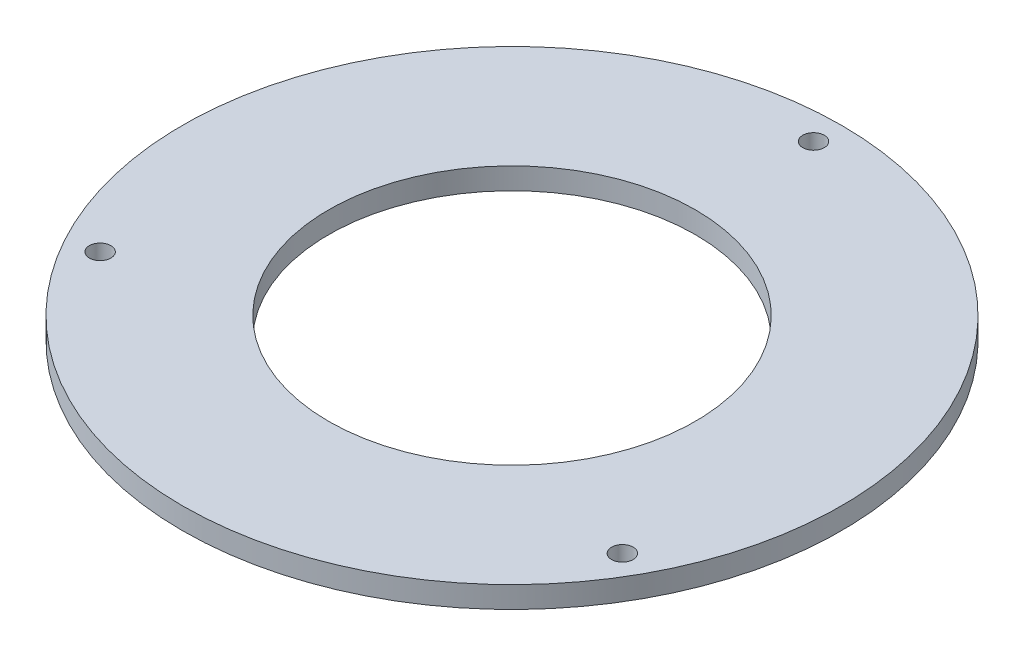
ISO-10303-21;
HEADER;
FILE_DESCRIPTION(('STEP AP214'),'2;1');
FILE_NAME('part.step','',(''),(''),'','','');
FILE_SCHEMA(('AUTOMOTIVE_DESIGN { 1 0 10303 214 1 1 1 1 }'));
ENDSEC;
DATA;
#1=APPLICATION_CONTEXT('core data for automotive mechanical design processes');
#2=APPLICATION_PROTOCOL_DEFINITION('international standard','automotive_design',2000,#1);
#3=PRODUCT_CONTEXT('',#1,'mechanical');
#4=PRODUCT('Part','Part','',(#3));
#5=PRODUCT_RELATED_PRODUCT_CATEGORY('part','',(#4));
#6=PRODUCT_DEFINITION_FORMATION('','',#4);
#7=PRODUCT_DEFINITION_CONTEXT('part definition',#1,'design');
#8=PRODUCT_DEFINITION('design','',#6,#7);
#9=PRODUCT_DEFINITION_SHAPE('','',#8);
#10=(LENGTH_UNIT() NAMED_UNIT(*) SI_UNIT(.MILLI.,.METRE.));
#11=(NAMED_UNIT(*) PLANE_ANGLE_UNIT() SI_UNIT($,.RADIAN.));
#12=(NAMED_UNIT(*) SI_UNIT($,.STERADIAN.) SOLID_ANGLE_UNIT());
#13=UNCERTAINTY_MEASURE_WITH_UNIT(LENGTH_MEASURE(1.E-05),#10,'distance_accuracy_value','');
#14=(GEOMETRIC_REPRESENTATION_CONTEXT(3) GLOBAL_UNCERTAINTY_ASSIGNED_CONTEXT((#13)) GLOBAL_UNIT_ASSIGNED_CONTEXT((#10,
#11,#12)) REPRESENTATION_CONTEXT('',''));
#15=CARTESIAN_POINT('',(0.,0.,0.));
#16=DIRECTION('',(0.,0.,1.));
#17=DIRECTION('',(1.,0.,0.));
#18=AXIS2_PLACEMENT_3D('',#15,#16,#17);
#19=CARTESIAN_POINT('',(0.,6.35,0.));
#20=DIRECTION('',(0.,-1.,0.));
#21=DIRECTION('',(0.,0.,-1.));
#22=AXIS2_PLACEMENT_3D('',#19,#20,#21);
#23=CYLINDRICAL_SURFACE('',#22,97.028);
#24=CARTESIAN_POINT('',(0.,6.35,0.));
#25=DIRECTION('',(0.,1.,0.));
#26=DIRECTION('',(0.,0.,1.));
#27=AXIS2_PLACEMENT_3D('',#24,#25,#26);
#28=CIRCLE('',#27,97.028);
#29=CARTESIAN_POINT('',(0.,6.35,97.028));
#30=VERTEX_POINT('',#29);
#31=EDGE_CURVE('E10',#30,#30,#28,.T.);
#32=ORIENTED_EDGE('',*,*,#31,.F.);
#33=EDGE_LOOP('',(#32));
#34=FACE_BOUND('',#33,.T.);
#35=CARTESIAN_POINT('',(0.,0.,0.));
#36=DIRECTION('',(0.,1.,0.));
#37=DIRECTION('',(0.,0.,1.));
#38=AXIS2_PLACEMENT_3D('',#35,#36,#37);
#39=CIRCLE('',#38,97.028);
#40=CARTESIAN_POINT('',(0.,0.,97.028));
#41=VERTEX_POINT('',#40);
#42=EDGE_CURVE('E34',#41,#41,#39,.T.);
#43=ORIENTED_EDGE('',*,*,#42,.T.);
#44=EDGE_LOOP('',(#43));
#45=FACE_BOUND('',#44,.T.);
#46=ADVANCED_FACE('F31',(#34,#45),#23,.T.);
#47=CARTESIAN_POINT('',(0.,6.35,0.));
#48=DIRECTION('',(0.,1.,0.));
#49=DIRECTION('',(0.,0.,1.));
#50=AXIS2_PLACEMENT_3D('',#47,#48,#49);
#51=PLANE('',#50);
#52=CARTESIAN_POINT('',(0.,6.35,0.));
#53=DIRECTION('',(0.,1.,0.));
#54=DIRECTION('',(0.,0.,1.));
#55=AXIS2_PLACEMENT_3D('',#52,#53,#54);
#56=CIRCLE('',#55,53.975);
#57=CARTESIAN_POINT('',(0.,6.35,53.975));
#58=VERTEX_POINT('',#57);
#59=EDGE_CURVE('E61',#58,#58,#56,.T.);
#60=ORIENTED_EDGE('',*,*,#59,.F.);
#61=EDGE_LOOP('',(#60));
#62=FACE_BOUND('',#61,.T.);
#63=CARTESIAN_POINT('',(0.,6.35,-88.773));
#64=DIRECTION('',(0.,1.,0.));
#65=DIRECTION('',(0.,0.,1.));
#66=AXIS2_PLACEMENT_3D('',#63,#64,#65);
#67=CIRCLE('',#66,3.175);
#68=CARTESIAN_POINT('',(0.,6.35,-85.598));
#69=VERTEX_POINT('',#68);
#70=EDGE_CURVE('E56',#69,#69,#67,.T.);
#71=ORIENTED_EDGE('',*,*,#70,.F.);
#72=EDGE_LOOP('',(#71));
#73=FACE_BOUND('',#72,.T.);
#74=CARTESIAN_POINT('',(76.8796731701617,6.35,44.3864999999967));
#75=DIRECTION('',(0.,1.,0.));
#76=DIRECTION('',(0.,0.,1.));
#77=AXIS2_PLACEMENT_3D('',#74,#75,#76);
#78=CIRCLE('',#77,3.17500000000487);
#79=CARTESIAN_POINT('',(76.8796731701617,6.35,47.5615000000016));
#80=VERTEX_POINT('',#79);
#81=EDGE_CURVE('E50',#80,#80,#78,.T.);
#82=ORIENTED_EDGE('',*,*,#81,.F.);
#83=EDGE_LOOP('',(#82));
#84=FACE_BOUND('',#83,.T.);
#85=CARTESIAN_POINT('',(-76.8796731701503,6.35,44.3865000000033));
#86=DIRECTION('',(0.,1.,0.));
#87=DIRECTION('',(0.,0.,1.));
#88=AXIS2_PLACEMENT_3D('',#85,#86,#87);
#89=CIRCLE('',#88,3.17500000000717);
#90=CARTESIAN_POINT('',(-76.8796731701503,6.35,47.5615000000105));
#91=VERTEX_POINT('',#90);
#92=EDGE_CURVE('E43',#91,#91,#89,.T.);
#93=ORIENTED_EDGE('',*,*,#92,.F.);
#94=EDGE_LOOP('',(#93));
#95=FACE_BOUND('',#94,.T.);
#96=ORIENTED_EDGE('',*,*,#31,.T.);
#97=EDGE_LOOP('',(#96));
#98=FACE_BOUND('',#97,.T.);
#99=ADVANCED_FACE('F77',(#62,#73,#84,#95,#98),#51,.T.);
#100=CARTESIAN_POINT('',(0.,0.,0.));
#101=DIRECTION('',(0.,1.,0.));
#102=DIRECTION('',(0.,0.,1.));
#103=AXIS2_PLACEMENT_3D('',#100,#101,#102);
#104=PLANE('',#103);
#105=CARTESIAN_POINT('',(0.,0.,0.));
#106=DIRECTION('',(0.,1.,0.));
#107=DIRECTION('',(0.,0.,1.));
#108=AXIS2_PLACEMENT_3D('',#105,#106,#107);
#109=CIRCLE('',#108,53.975);
#110=CARTESIAN_POINT('',(0.,0.,53.975));
#111=VERTEX_POINT('',#110);
#112=EDGE_CURVE('E47',#111,#111,#109,.T.);
#113=ORIENTED_EDGE('',*,*,#112,.T.);
#114=EDGE_LOOP('',(#113));
#115=FACE_BOUND('',#114,.T.);
#116=CARTESIAN_POINT('',(0.,0.,-88.773));
#117=DIRECTION('',(0.,1.,0.));
#118=DIRECTION('',(0.,0.,1.));
#119=AXIS2_PLACEMENT_3D('',#116,#117,#118);
#120=CIRCLE('',#119,3.175);
#121=CARTESIAN_POINT('',(0.,0.,-85.598));
#122=VERTEX_POINT('',#121);
#123=EDGE_CURVE('E41',#122,#122,#120,.T.);
#124=ORIENTED_EDGE('',*,*,#123,.T.);
#125=EDGE_LOOP('',(#124));
#126=FACE_BOUND('',#125,.T.);
#127=CARTESIAN_POINT('',(76.8796731701617,0.,44.3864999999967));
#128=DIRECTION('',(0.,1.,0.));
#129=DIRECTION('',(0.,0.,1.));
#130=AXIS2_PLACEMENT_3D('',#127,#128,#129);
#131=CIRCLE('',#130,3.17500000000487);
#132=CARTESIAN_POINT('',(76.8796731701617,0.,47.5615000000016));
#133=VERTEX_POINT('',#132);
#134=EDGE_CURVE('E53',#133,#133,#131,.T.);
#135=ORIENTED_EDGE('',*,*,#134,.T.);
#136=EDGE_LOOP('',(#135));
#137=FACE_BOUND('',#136,.T.);
#138=CARTESIAN_POINT('',(-76.8796731701503,0.,44.3865000000033));
#139=DIRECTION('',(0.,1.,0.));
#140=DIRECTION('',(0.,0.,1.));
#141=AXIS2_PLACEMENT_3D('',#138,#139,#140);
#142=CIRCLE('',#141,3.17500000000717);
#143=CARTESIAN_POINT('',(-76.8796731701503,0.,47.5615000000105));
#144=VERTEX_POINT('',#143);
#145=EDGE_CURVE('E46',#144,#144,#142,.T.);
#146=ORIENTED_EDGE('',*,*,#145,.T.);
#147=EDGE_LOOP('',(#146));
#148=FACE_BOUND('',#147,.T.);
#149=ORIENTED_EDGE('',*,*,#42,.F.);
#150=EDGE_LOOP('',(#149));
#151=FACE_BOUND('',#150,.T.);
#152=ADVANCED_FACE('F67',(#115,#126,#137,#148,#151),#104,.F.);
#153=CARTESIAN_POINT('',(-76.8796731701503,0.,44.3865000000033));
#154=DIRECTION('',(0.,1.,0.));
#155=DIRECTION('',(0.,0.,1.));
#156=AXIS2_PLACEMENT_3D('',#153,#154,#155);
#157=CYLINDRICAL_SURFACE('',#156,3.17500000000717);
#158=ORIENTED_EDGE('',*,*,#145,.F.);
#159=EDGE_LOOP('',(#158));
#160=FACE_BOUND('',#159,.T.);
#161=ORIENTED_EDGE('',*,*,#92,.T.);
#162=EDGE_LOOP('',(#161));
#163=FACE_BOUND('',#162,.T.);
#164=ADVANCED_FACE('F87',(#160,#163),#157,.F.);
#165=CARTESIAN_POINT('',(76.8796731701617,0.,44.3864999999967));
#166=DIRECTION('',(0.,1.,0.));
#167=DIRECTION('',(0.,0.,1.));
#168=AXIS2_PLACEMENT_3D('',#165,#166,#167);
#169=CYLINDRICAL_SURFACE('',#168,3.17500000000487);
#170=ORIENTED_EDGE('',*,*,#134,.F.);
#171=EDGE_LOOP('',(#170));
#172=FACE_BOUND('',#171,.T.);
#173=ORIENTED_EDGE('',*,*,#81,.T.);
#174=EDGE_LOOP('',(#173));
#175=FACE_BOUND('',#174,.T.);
#176=ADVANCED_FACE('F89',(#172,#175),#169,.F.);
#177=CARTESIAN_POINT('',(0.,0.,-88.773));
#178=DIRECTION('',(0.,1.,0.));
#179=DIRECTION('',(0.,0.,1.));
#180=AXIS2_PLACEMENT_3D('',#177,#178,#179);
#181=CYLINDRICAL_SURFACE('',#180,3.175);
#182=ORIENTED_EDGE('',*,*,#123,.F.);
#183=EDGE_LOOP('',(#182));
#184=FACE_BOUND('',#183,.T.);
#185=ORIENTED_EDGE('',*,*,#70,.T.);
#186=EDGE_LOOP('',(#185));
#187=FACE_BOUND('',#186,.T.);
#188=ADVANCED_FACE('F73',(#184,#187),#181,.F.);
#189=CARTESIAN_POINT('',(0.,0.,0.));
#190=DIRECTION('',(0.,1.,0.));
#191=DIRECTION('',(0.,0.,1.));
#192=AXIS2_PLACEMENT_3D('',#189,#190,#191);
#193=CYLINDRICAL_SURFACE('',#192,53.975);
#194=ORIENTED_EDGE('',*,*,#112,.F.);
#195=EDGE_LOOP('',(#194));
#196=FACE_BOUND('',#195,.T.);
#197=ORIENTED_EDGE('',*,*,#59,.T.);
#198=EDGE_LOOP('',(#197));
#199=FACE_BOUND('',#198,.T.);
#200=ADVANCED_FACE('F70',(#196,#199),#193,.F.);
#201=CLOSED_SHELL('',(#46,#99,#152,#164,#176,#188,#200));
#202=MANIFOLD_SOLID_BREP('B2',#201);
#203=ADVANCED_BREP_SHAPE_REPRESENTATION('',(#18,#202),#14);
#204=SHAPE_DEFINITION_REPRESENTATION(#9,#203);
ENDSEC;
END-ISO-10303-21;
